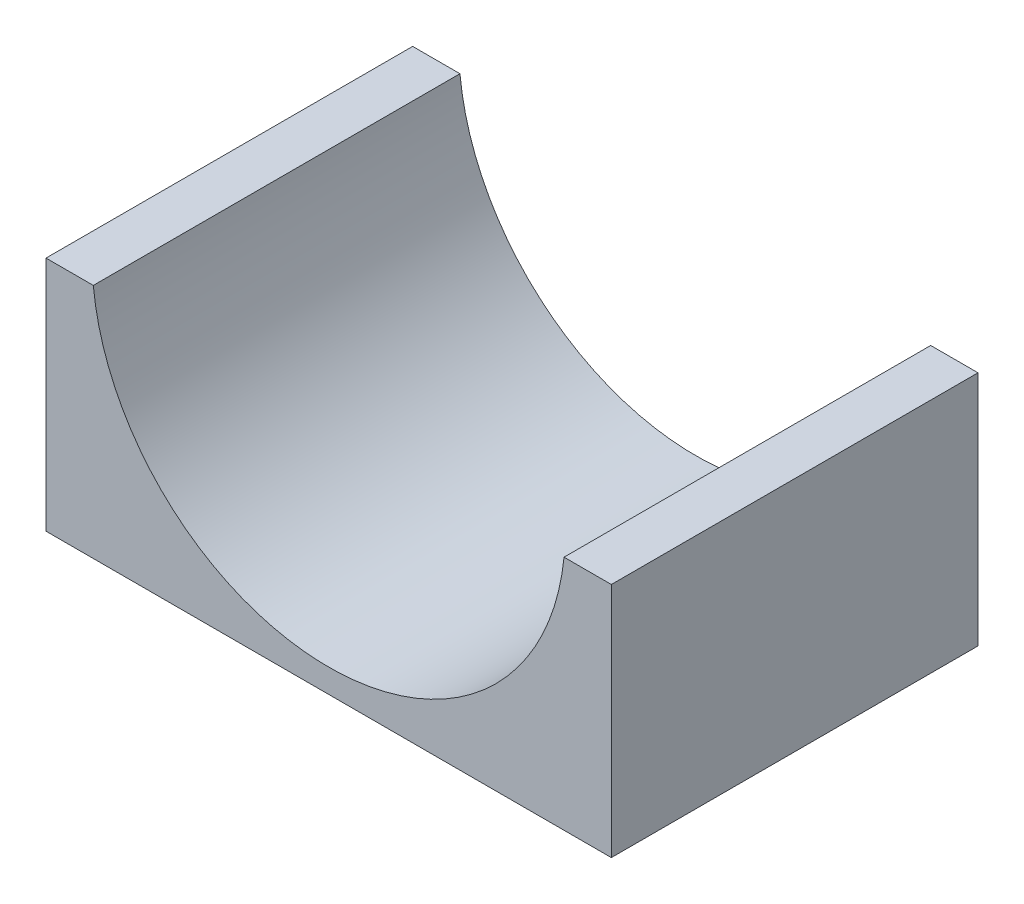
ISO-10303-21;
HEADER;
FILE_DESCRIPTION(('STEP AP214'),'2;1');
FILE_NAME('part.step','',(''),(''),'','','');
FILE_SCHEMA(('AUTOMOTIVE_DESIGN { 1 0 10303 214 1 1 1 1 }'));
ENDSEC;
DATA;
#1=APPLICATION_CONTEXT('core data for automotive mechanical design processes');
#2=APPLICATION_PROTOCOL_DEFINITION('international standard','automotive_design',2000,#1);
#3=PRODUCT_CONTEXT('',#1,'mechanical');
#4=PRODUCT('Part','Part','',(#3));
#5=PRODUCT_RELATED_PRODUCT_CATEGORY('part','',(#4));
#6=PRODUCT_DEFINITION_FORMATION('','',#4);
#7=PRODUCT_DEFINITION_CONTEXT('part definition',#1,'design');
#8=PRODUCT_DEFINITION('design','',#6,#7);
#9=PRODUCT_DEFINITION_SHAPE('','',#8);
#10=(LENGTH_UNIT() NAMED_UNIT(*) SI_UNIT(.MILLI.,.METRE.));
#11=(NAMED_UNIT(*) PLANE_ANGLE_UNIT() SI_UNIT($,.RADIAN.));
#12=(NAMED_UNIT(*) SI_UNIT($,.STERADIAN.) SOLID_ANGLE_UNIT());
#13=UNCERTAINTY_MEASURE_WITH_UNIT(LENGTH_MEASURE(1.E-05),#10,'distance_accuracy_value','');
#14=(GEOMETRIC_REPRESENTATION_CONTEXT(3) GLOBAL_UNCERTAINTY_ASSIGNED_CONTEXT((#13)) GLOBAL_UNIT_ASSIGNED_CONTEXT((#10,
#11,#12)) REPRESENTATION_CONTEXT('',''));
#15=CARTESIAN_POINT('',(0.,0.,0.));
#16=DIRECTION('',(0.,0.,1.));
#17=DIRECTION('',(1.,0.,0.));
#18=AXIS2_PLACEMENT_3D('',#15,#16,#17);
#19=CARTESIAN_POINT('',(-11.1862210329446,1.73369443414471,15.5));
#20=DIRECTION('',(1.,0.,0.));
#21=DIRECTION('',(0.,1.,0.));
#22=AXIS2_PLACEMENT_3D('',#19,#20,#21);
#23=PLANE('',#22);
#24=DIRECTION('',(0.,-1.,0.));
#25=VECTOR('',#24,1.);
#26=CARTESIAN_POINT('',(-11.1862210329446,1.73369443414471,0.));
#27=LINE('',#26,#25);
#28=CARTESIAN_POINT('',(-11.1862210329446,1.73369443414471,0.));
#29=VERTEX_POINT('',#28);
#30=CARTESIAN_POINT('',(-11.1862210329446,-8.26630556585529,0.));
#31=VERTEX_POINT('',#30);
#32=EDGE_CURVE('E121',#29,#31,#27,.T.);
#33=ORIENTED_EDGE('',*,*,#32,.T.);
#34=DIRECTION('',(0.,0.,-1.));
#35=VECTOR('',#34,1.);
#36=CARTESIAN_POINT('',(-11.1862210329446,-8.26630556585529,15.5));
#37=LINE('',#36,#35);
#38=CARTESIAN_POINT('',(-11.1862210329446,-8.26630556585529,15.5));
#39=VERTEX_POINT('',#38);
#40=EDGE_CURVE('E11',#39,#31,#37,.T.);
#41=ORIENTED_EDGE('',*,*,#40,.F.);
#42=DIRECTION('',(0.,-1.,0.));
#43=VECTOR('',#42,1.);
#44=CARTESIAN_POINT('',(-11.1862210329446,1.73369443414471,15.5));
#45=LINE('',#44,#43);
#46=CARTESIAN_POINT('',(-11.1862210329446,1.73369443414471,15.5));
#47=VERTEX_POINT('',#46);
#48=EDGE_CURVE('E131',#47,#39,#45,.T.);
#49=ORIENTED_EDGE('',*,*,#48,.F.);
#50=DIRECTION('',(0.,0.,-1.));
#51=VECTOR('',#50,1.);
#52=CARTESIAN_POINT('',(-11.1862210329446,1.73369443414471,15.5));
#53=LINE('',#52,#51);
#54=EDGE_CURVE('E117',#47,#29,#53,.T.);
#55=ORIENTED_EDGE('',*,*,#54,.T.);
#56=EDGE_LOOP('',(#33,#41,#49,#55));
#57=FACE_BOUND('',#56,.T.);
#58=ADVANCED_FACE('F37',(#57),#23,.F.);
#59=CARTESIAN_POINT('',(-11.1862210329446,-8.26630556585529,15.5));
#60=DIRECTION('',(0.,1.,0.));
#61=DIRECTION('',(0.,0.,1.));
#62=AXIS2_PLACEMENT_3D('',#59,#60,#61);
#63=PLANE('',#62);
#64=DIRECTION('',(1.,0.,0.));
#65=VECTOR('',#64,1.);
#66=CARTESIAN_POINT('',(-11.1862210329446,-8.26630556585529,0.));
#67=LINE('',#66,#65);
#68=CARTESIAN_POINT('',(12.7135277091878,-8.26630556585529,0.));
#69=VERTEX_POINT('',#68);
#70=EDGE_CURVE('E124',#31,#69,#67,.T.);
#71=ORIENTED_EDGE('',*,*,#70,.T.);
#72=DIRECTION('',(0.,0.,-1.));
#73=VECTOR('',#72,1.);
#74=CARTESIAN_POINT('',(12.7135277091878,-8.26630556585529,15.5));
#75=LINE('',#74,#73);
#76=CARTESIAN_POINT('',(12.7135277091878,-8.26630556585529,15.5));
#77=VERTEX_POINT('',#76);
#78=EDGE_CURVE('E45',#77,#69,#75,.T.);
#79=ORIENTED_EDGE('',*,*,#78,.F.);
#80=DIRECTION('',(1.,0.,0.));
#81=VECTOR('',#80,1.);
#82=CARTESIAN_POINT('',(-11.1862210329446,-8.26630556585529,15.5));
#83=LINE('',#82,#81);
#84=EDGE_CURVE('E90',#39,#77,#83,.T.);
#85=ORIENTED_EDGE('',*,*,#84,.F.);
#86=ORIENTED_EDGE('',*,*,#40,.T.);
#87=EDGE_LOOP('',(#71,#79,#85,#86));
#88=FACE_BOUND('',#87,.T.);
#89=ADVANCED_FACE('F155',(#88),#63,.F.);
#90=CARTESIAN_POINT('',(12.7135277091878,1.73369443414471,15.5));
#91=DIRECTION('',(-1.,0.,0.));
#92=DIRECTION('',(0.,-1.,0.));
#93=AXIS2_PLACEMENT_3D('',#90,#91,#92);
#94=PLANE('',#93);
#95=DIRECTION('',(0.,1.,0.));
#96=VECTOR('',#95,1.);
#97=CARTESIAN_POINT('',(12.7135277091878,1.73369443414471,0.));
#98=LINE('',#97,#96);
#99=CARTESIAN_POINT('',(12.7135277091878,1.73369443414471,0.));
#100=VERTEX_POINT('',#99);
#101=EDGE_CURVE('E126',#69,#100,#98,.T.);
#102=ORIENTED_EDGE('',*,*,#101,.T.);
#103=DIRECTION('',(0.,0.,-1.));
#104=VECTOR('',#103,1.);
#105=CARTESIAN_POINT('',(12.7135277091878,1.73369443414471,15.5));
#106=LINE('',#105,#104);
#107=CARTESIAN_POINT('',(12.7135277091878,1.73369443414471,15.5));
#108=VERTEX_POINT('',#107);
#109=EDGE_CURVE('E112',#108,#100,#106,.T.);
#110=ORIENTED_EDGE('',*,*,#109,.F.);
#111=DIRECTION('',(0.,1.,0.));
#112=VECTOR('',#111,1.);
#113=CARTESIAN_POINT('',(12.7135277091878,1.73369443414471,15.5));
#114=LINE('',#113,#112);
#115=EDGE_CURVE('E103',#77,#108,#114,.T.);
#116=ORIENTED_EDGE('',*,*,#115,.F.);
#117=ORIENTED_EDGE('',*,*,#78,.T.);
#118=EDGE_LOOP('',(#102,#110,#116,#117));
#119=FACE_BOUND('',#118,.T.);
#120=ADVANCED_FACE('F137',(#119),#94,.F.);
#121=CARTESIAN_POINT('',(10.7135277091878,1.73369443414471,15.5));
#122=DIRECTION('',(0.,-1.,0.));
#123=DIRECTION('',(0.,0.,-1.));
#124=AXIS2_PLACEMENT_3D('',#121,#122,#123);
#125=PLANE('',#124);
#126=DIRECTION('',(-1.,0.,0.));
#127=VECTOR('',#126,1.);
#128=CARTESIAN_POINT('',(10.7135277091878,1.73369443414471,0.));
#129=LINE('',#128,#127);
#130=CARTESIAN_POINT('',(10.7135277091878,1.73369443414471,0.));
#131=VERTEX_POINT('',#130);
#132=EDGE_CURVE('E111',#100,#131,#129,.T.);
#133=ORIENTED_EDGE('',*,*,#132,.T.);
#134=DIRECTION('',(0.,0.,-1.));
#135=VECTOR('',#134,1.);
#136=CARTESIAN_POINT('',(10.7135277091878,1.73369443414471,15.5));
#137=LINE('',#136,#135);
#138=CARTESIAN_POINT('',(10.7135277091878,1.73369443414471,15.5));
#139=VERTEX_POINT('',#138);
#140=EDGE_CURVE('E108',#139,#131,#137,.T.);
#141=ORIENTED_EDGE('',*,*,#140,.F.);
#142=DIRECTION('',(-1.,0.,0.));
#143=VECTOR('',#142,1.);
#144=CARTESIAN_POINT('',(10.7135277091878,1.73369443414471,15.5));
#145=LINE('',#144,#143);
#146=EDGE_CURVE('E97',#108,#139,#145,.T.);
#147=ORIENTED_EDGE('',*,*,#146,.F.);
#148=ORIENTED_EDGE('',*,*,#109,.T.);
#149=EDGE_LOOP('',(#133,#141,#147,#148));
#150=FACE_BOUND('',#149,.T.);
#151=ADVANCED_FACE('F109',(#150),#125,.F.);
#152=CARTESIAN_POINT('',(0.763653338121555,2.73369443414471,15.5));
#153=DIRECTION('',(0.,0.,-1.));
#154=DIRECTION('',(-1.,0.,0.));
#155=AXIS2_PLACEMENT_3D('',#152,#153,#154);
#156=CYLINDRICAL_SURFACE('',#155,10.);
#157=CARTESIAN_POINT('',(0.763653338121555,2.73369443414471,0.));
#158=DIRECTION('',(0.,0.,-1.));
#159=DIRECTION('',(1.,0.,0.));
#160=AXIS2_PLACEMENT_3D('',#157,#158,#159);
#161=CIRCLE('',#160,10.);
#162=CARTESIAN_POINT('',(-9.18622103294464,1.73369443414471,0.));
#163=VERTEX_POINT('',#162);
#164=EDGE_CURVE('E76',#131,#163,#161,.T.);
#165=ORIENTED_EDGE('',*,*,#164,.T.);
#166=DIRECTION('',(0.,0.,-1.));
#167=VECTOR('',#166,1.);
#168=CARTESIAN_POINT('',(-9.18622103294464,1.73369443414471,15.5));
#169=LINE('',#168,#167);
#170=CARTESIAN_POINT('',(-9.18622103294464,1.73369443414471,15.5));
#171=VERTEX_POINT('',#170);
#172=EDGE_CURVE('E113',#171,#163,#169,.T.);
#173=ORIENTED_EDGE('',*,*,#172,.F.);
#174=CARTESIAN_POINT('',(0.763653338121555,2.73369443414471,15.5));
#175=DIRECTION('',(0.,0.,-1.));
#176=DIRECTION('',(1.,0.,0.));
#177=AXIS2_PLACEMENT_3D('',#174,#175,#176);
#178=CIRCLE('',#177,10.);
#179=EDGE_CURVE('E101',#139,#171,#178,.T.);
#180=ORIENTED_EDGE('',*,*,#179,.F.);
#181=ORIENTED_EDGE('',*,*,#140,.T.);
#182=EDGE_LOOP('',(#165,#173,#180,#181));
#183=FACE_BOUND('',#182,.T.);
#184=ADVANCED_FACE('F115',(#183),#156,.F.);
#185=CARTESIAN_POINT('',(-11.1862210329446,1.73369443414471,15.5));
#186=DIRECTION('',(0.,-1.,0.));
#187=DIRECTION('',(0.,0.,-1.));
#188=AXIS2_PLACEMENT_3D('',#185,#186,#187);
#189=PLANE('',#188);
#190=DIRECTION('',(-1.,0.,0.));
#191=VECTOR('',#190,1.);
#192=CARTESIAN_POINT('',(-11.1862210329446,1.73369443414471,0.));
#193=LINE('',#192,#191);
#194=EDGE_CURVE('E82',#163,#29,#193,.T.);
#195=ORIENTED_EDGE('',*,*,#194,.T.);
#196=ORIENTED_EDGE('',*,*,#54,.F.);
#197=DIRECTION('',(-1.,0.,0.));
#198=VECTOR('',#197,1.);
#199=CARTESIAN_POINT('',(-11.1862210329446,1.73369443414471,15.5));
#200=LINE('',#199,#198);
#201=EDGE_CURVE('E53',#171,#47,#200,.T.);
#202=ORIENTED_EDGE('',*,*,#201,.F.);
#203=ORIENTED_EDGE('',*,*,#172,.T.);
#204=EDGE_LOOP('',(#195,#196,#202,#203));
#205=FACE_BOUND('',#204,.T.);
#206=ADVANCED_FACE('F144',(#205),#189,.F.);
#207=CARTESIAN_POINT('',(0.763653338121555,2.73369443414471,15.5));
#208=DIRECTION('',(0.,0.,1.));
#209=DIRECTION('',(1.,0.,0.));
#210=AXIS2_PLACEMENT_3D('',#207,#208,#209);
#211=PLANE('',#210);
#212=ORIENTED_EDGE('',*,*,#48,.T.);
#213=ORIENTED_EDGE('',*,*,#84,.T.);
#214=ORIENTED_EDGE('',*,*,#115,.T.);
#215=ORIENTED_EDGE('',*,*,#146,.T.);
#216=ORIENTED_EDGE('',*,*,#179,.T.);
#217=ORIENTED_EDGE('',*,*,#201,.T.);
#218=EDGE_LOOP('',(#212,#213,#214,#215,#216,#217));
#219=FACE_BOUND('',#218,.T.);
#220=ADVANCED_FACE('F99',(#219),#211,.T.);
#221=CARTESIAN_POINT('',(0.763653338121555,2.73369443414471,0.));
#222=DIRECTION('',(0.,0.,1.));
#223=DIRECTION('',(1.,0.,0.));
#224=AXIS2_PLACEMENT_3D('',#221,#222,#223);
#225=PLANE('',#224);
#226=ORIENTED_EDGE('',*,*,#32,.F.);
#227=ORIENTED_EDGE('',*,*,#194,.F.);
#228=ORIENTED_EDGE('',*,*,#164,.F.);
#229=ORIENTED_EDGE('',*,*,#132,.F.);
#230=ORIENTED_EDGE('',*,*,#101,.F.);
#231=ORIENTED_EDGE('',*,*,#70,.F.);
#232=EDGE_LOOP('',(#226,#227,#228,#229,#230,#231));
#233=FACE_BOUND('',#232,.T.);
#234=ADVANCED_FACE('F140',(#233),#225,.F.);
#235=CLOSED_SHELL('',(#58,#89,#120,#151,#184,#206,#220,#234));
#236=MANIFOLD_SOLID_BREP('B2',#235);
#237=ADVANCED_BREP_SHAPE_REPRESENTATION('',(#18,#236),#14);
#238=SHAPE_DEFINITION_REPRESENTATION(#9,#237);
ENDSEC;
END-ISO-10303-21;
